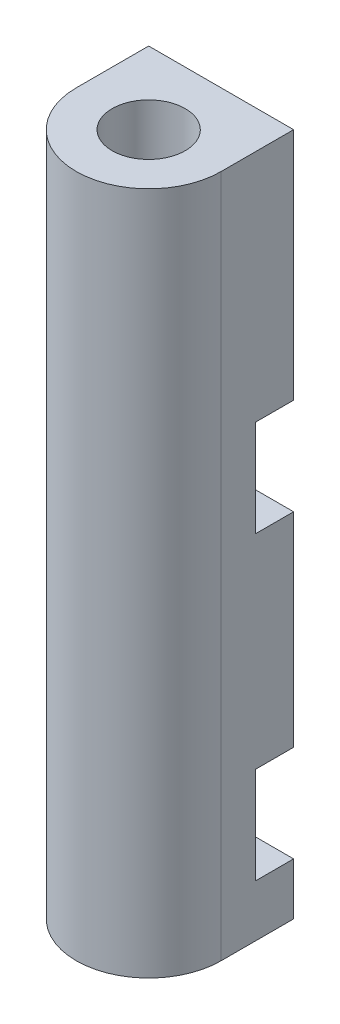
ISO-10303-21;
HEADER;
FILE_DESCRIPTION(('STEP AP214'),'2;1');
FILE_NAME('part.step','',(''),(''),'','','');
FILE_SCHEMA(('AUTOMOTIVE_DESIGN { 1 0 10303 214 1 1 1 1 }'));
ENDSEC;
DATA;
#1=APPLICATION_CONTEXT('core data for automotive mechanical design processes');
#2=APPLICATION_PROTOCOL_DEFINITION('international standard','automotive_design',2000,#1);
#3=PRODUCT_CONTEXT('',#1,'mechanical');
#4=PRODUCT('Part','Part','',(#3));
#5=PRODUCT_RELATED_PRODUCT_CATEGORY('part','',(#4));
#6=PRODUCT_DEFINITION_FORMATION('','',#4);
#7=PRODUCT_DEFINITION_CONTEXT('part definition',#1,'design');
#8=PRODUCT_DEFINITION('design','',#6,#7);
#9=PRODUCT_DEFINITION_SHAPE('','',#8);
#10=(LENGTH_UNIT() NAMED_UNIT(*) SI_UNIT(.MILLI.,.METRE.));
#11=(NAMED_UNIT(*) PLANE_ANGLE_UNIT() SI_UNIT($,.RADIAN.));
#12=(NAMED_UNIT(*) SI_UNIT($,.STERADIAN.) SOLID_ANGLE_UNIT());
#13=UNCERTAINTY_MEASURE_WITH_UNIT(LENGTH_MEASURE(1.E-05),#10,'distance_accuracy_value','');
#14=(GEOMETRIC_REPRESENTATION_CONTEXT(3) GLOBAL_UNCERTAINTY_ASSIGNED_CONTEXT((#13)) GLOBAL_UNIT_ASSIGNED_CONTEXT((#10,
#11,#12)) REPRESENTATION_CONTEXT('',''));
#15=CARTESIAN_POINT('',(0.,0.,0.));
#16=DIRECTION('',(0.,0.,1.));
#17=DIRECTION('',(1.,0.,0.));
#18=AXIS2_PLACEMENT_3D('',#15,#16,#17);
#19=CARTESIAN_POINT('',(0.,56.6,0.));
#20=DIRECTION('',(0.,1.,0.));
#21=DIRECTION('',(0.,0.,1.));
#22=AXIS2_PLACEMENT_3D('',#19,#20,#21);
#23=PLANE('',#22);
#24=DIRECTION('',(0.,0.,-1.));
#25=VECTOR('',#24,1.);
#26=CARTESIAN_POINT('',(-6.,56.6,0.));
#27=LINE('',#26,#25);
#28=CARTESIAN_POINT('',(-6.,56.6,0.));
#29=VERTEX_POINT('',#28);
#30=CARTESIAN_POINT('',(-6.,56.6,-6.));
#31=VERTEX_POINT('',#30);
#32=EDGE_CURVE('E219',#29,#31,#27,.T.);
#33=ORIENTED_EDGE('',*,*,#32,.F.);
#34=CARTESIAN_POINT('',(0.,56.6,0.));
#35=DIRECTION('',(0.,1.,0.));
#36=DIRECTION('',(0.,0.,1.));
#37=AXIS2_PLACEMENT_3D('',#34,#35,#36);
#38=CIRCLE('',#37,6.);
#39=CARTESIAN_POINT('',(6.,56.6,0.));
#40=VERTEX_POINT('',#39);
#41=EDGE_CURVE('E227',#29,#40,#38,.T.);
#42=ORIENTED_EDGE('',*,*,#41,.T.);
#43=DIRECTION('',(0.,0.,1.));
#44=VECTOR('',#43,1.);
#45=CARTESIAN_POINT('',(6.,56.6,-6.));
#46=LINE('',#45,#44);
#47=CARTESIAN_POINT('',(6.,56.6,-6.));
#48=VERTEX_POINT('',#47);
#49=EDGE_CURVE('E225',#48,#40,#46,.T.);
#50=ORIENTED_EDGE('',*,*,#49,.F.);
#51=DIRECTION('',(1.,0.,0.));
#52=VECTOR('',#51,1.);
#53=CARTESIAN_POINT('',(-6.,56.6,-6.));
#54=LINE('',#53,#52);
#55=EDGE_CURVE('E221',#31,#48,#54,.T.);
#56=ORIENTED_EDGE('',*,*,#55,.F.);
#57=EDGE_LOOP('',(#33,#42,#50,#56));
#58=FACE_BOUND('',#57,.T.);
#59=CARTESIAN_POINT('',(0.,56.6,0.));
#60=DIRECTION('',(0.,1.,0.));
#61=DIRECTION('',(0.,0.,1.));
#62=AXIS2_PLACEMENT_3D('',#59,#60,#61);
#63=CIRCLE('',#62,3.025);
#64=CARTESIAN_POINT('',(0.,56.6,3.025));
#65=VERTEX_POINT('',#64);
#66=EDGE_CURVE('E213',#65,#65,#63,.T.);
#67=ORIENTED_EDGE('',*,*,#66,.F.);
#68=EDGE_LOOP('',(#67));
#69=FACE_BOUND('',#68,.T.);
#70=ADVANCED_FACE('F55',(#58,#69),#23,.T.);
#71=CARTESIAN_POINT('',(0.,0.,0.));
#72=DIRECTION('',(0.,1.,0.));
#73=DIRECTION('',(0.,0.,1.));
#74=AXIS2_PLACEMENT_3D('',#71,#72,#73);
#75=PLANE('',#74);
#76=CARTESIAN_POINT('',(0.,0.,0.));
#77=DIRECTION('',(0.,1.,0.));
#78=DIRECTION('',(0.,0.,1.));
#79=AXIS2_PLACEMENT_3D('',#76,#77,#78);
#80=CIRCLE('',#79,6.);
#81=CARTESIAN_POINT('',(-6.,0.,0.));
#82=VERTEX_POINT('',#81);
#83=CARTESIAN_POINT('',(6.,0.,0.));
#84=VERTEX_POINT('',#83);
#85=EDGE_CURVE('E222',#82,#84,#80,.T.);
#86=ORIENTED_EDGE('',*,*,#85,.F.);
#87=DIRECTION('',(0.,0.,-1.));
#88=VECTOR('',#87,1.);
#89=CARTESIAN_POINT('',(-6.,0.,-5.43));
#90=LINE('',#89,#88);
#91=CARTESIAN_POINT('',(-6.,0.,-6.));
#92=VERTEX_POINT('',#91);
#93=EDGE_CURVE('E216',#82,#92,#90,.T.);
#94=ORIENTED_EDGE('',*,*,#93,.T.);
#95=DIRECTION('',(1.,0.,0.));
#96=VECTOR('',#95,1.);
#97=CARTESIAN_POINT('',(-6.,0.,-6.));
#98=LINE('',#97,#96);
#99=CARTESIAN_POINT('',(6.,0.,-6.));
#100=VERTEX_POINT('',#99);
#101=EDGE_CURVE('E233',#92,#100,#98,.T.);
#102=ORIENTED_EDGE('',*,*,#101,.T.);
#103=DIRECTION('',(0.,0.,1.));
#104=VECTOR('',#103,1.);
#105=CARTESIAN_POINT('',(6.,0.,-5.43));
#106=LINE('',#105,#104);
#107=EDGE_CURVE('E236',#100,#84,#106,.T.);
#108=ORIENTED_EDGE('',*,*,#107,.T.);
#109=EDGE_LOOP('',(#86,#94,#102,#108));
#110=FACE_BOUND('',#109,.T.);
#111=CARTESIAN_POINT('',(0.,0.,0.));
#112=DIRECTION('',(0.,1.,0.));
#113=DIRECTION('',(0.,0.,1.));
#114=AXIS2_PLACEMENT_3D('',#111,#112,#113);
#115=CIRCLE('',#114,3.025);
#116=CARTESIAN_POINT('',(0.,0.,3.025));
#117=VERTEX_POINT('',#116);
#118=EDGE_CURVE('E212',#117,#117,#115,.T.);
#119=ORIENTED_EDGE('',*,*,#118,.T.);
#120=EDGE_LOOP('',(#119));
#121=FACE_BOUND('',#120,.T.);
#122=ADVANCED_FACE('F286',(#110,#121),#75,.F.);
#123=CARTESIAN_POINT('',(0.,56.6,0.));
#124=DIRECTION('',(0.,-1.,0.));
#125=DIRECTION('',(0.,0.,-1.));
#126=AXIS2_PLACEMENT_3D('',#123,#124,#125);
#127=CYLINDRICAL_SURFACE('',#126,6.);
#128=ORIENTED_EDGE('',*,*,#85,.T.);
#129=DIRECTION('',(0.,-1.,0.));
#130=VECTOR('',#129,1.);
#131=CARTESIAN_POINT('',(6.,56.6,0.));
#132=LINE('',#131,#130);
#133=EDGE_CURVE('E245',#40,#84,#132,.T.);
#134=ORIENTED_EDGE('',*,*,#133,.F.);
#135=ORIENTED_EDGE('',*,*,#41,.F.);
#136=DIRECTION('',(0.,-1.,0.));
#137=VECTOR('',#136,1.);
#138=CARTESIAN_POINT('',(-6.,56.6,0.));
#139=LINE('',#138,#137);
#140=EDGE_CURVE('E241',#29,#82,#139,.T.);
#141=ORIENTED_EDGE('',*,*,#140,.T.);
#142=EDGE_LOOP('',(#128,#134,#135,#141));
#143=FACE_BOUND('',#142,.T.);
#144=ADVANCED_FACE('F291',(#143),#127,.T.);
#145=CARTESIAN_POINT('',(6.,56.6,-5.43));
#146=DIRECTION('',(1.,0.,0.));
#147=DIRECTION('',(0.,0.,-1.));
#148=AXIS2_PLACEMENT_3D('',#145,#146,#147);
#149=PLANE('',#148);
#150=DIRECTION('',(0.,0.,1.));
#151=VECTOR('',#150,1.);
#152=CARTESIAN_POINT('',(6.,12.3079990340509,-5.43));
#153=LINE('',#152,#151);
#154=CARTESIAN_POINT('',(6.,12.3079990340509,-6.));
#155=VERTEX_POINT('',#154);
#156=CARTESIAN_POINT('',(6.,12.3079990340509,-2.825));
#157=VERTEX_POINT('',#156);
#158=EDGE_CURVE('E210',#155,#157,#153,.T.);
#159=ORIENTED_EDGE('',*,*,#158,.F.);
#160=DIRECTION('',(0.,-1.,0.));
#161=VECTOR('',#160,1.);
#162=CARTESIAN_POINT('',(6.,56.6,-6.));
#163=LINE('',#162,#161);
#164=CARTESIAN_POINT('',(6.,29.1999990340405,-6.));
#165=VERTEX_POINT('',#164);
#166=EDGE_CURVE('E250',#165,#155,#163,.T.);
#167=ORIENTED_EDGE('',*,*,#166,.F.);
#168=DIRECTION('',(0.,0.,-1.));
#169=VECTOR('',#168,1.);
#170=CARTESIAN_POINT('',(6.,29.1999990340405,-5.43));
#171=LINE('',#170,#169);
#172=CARTESIAN_POINT('',(6.,29.1999990340405,-2.825));
#173=VERTEX_POINT('',#172);
#174=EDGE_CURVE('E78',#173,#165,#171,.T.);
#175=ORIENTED_EDGE('',*,*,#174,.F.);
#176=DIRECTION('',(0.,-1.,0.));
#177=VECTOR('',#176,1.);
#178=CARTESIAN_POINT('',(6.,56.6,-2.825));
#179=LINE('',#178,#177);
#180=CARTESIAN_POINT('',(6.,37.1999990340405,-2.825));
#181=VERTEX_POINT('',#180);
#182=EDGE_CURVE('E185',#181,#173,#179,.T.);
#183=ORIENTED_EDGE('',*,*,#182,.F.);
#184=DIRECTION('',(0.,0.,1.));
#185=VECTOR('',#184,1.);
#186=CARTESIAN_POINT('',(6.,37.1999990340405,-5.43));
#187=LINE('',#186,#185);
#188=CARTESIAN_POINT('',(6.,37.1999990340405,-6.));
#189=VERTEX_POINT('',#188);
#190=EDGE_CURVE('E205',#189,#181,#187,.T.);
#191=ORIENTED_EDGE('',*,*,#190,.F.);
#192=EDGE_CURVE('E247',#48,#189,#163,.T.);
#193=ORIENTED_EDGE('',*,*,#192,.F.);
#194=ORIENTED_EDGE('',*,*,#49,.T.);
#195=ORIENTED_EDGE('',*,*,#133,.T.);
#196=ORIENTED_EDGE('',*,*,#107,.F.);
#197=CARTESIAN_POINT('',(6.,4.30799903405329,-6.));
#198=VERTEX_POINT('',#197);
#199=EDGE_CURVE('E251',#198,#100,#163,.T.);
#200=ORIENTED_EDGE('',*,*,#199,.F.);
#201=DIRECTION('',(0.,0.,-1.));
#202=VECTOR('',#201,1.);
#203=CARTESIAN_POINT('',(6.,4.30799903405327,-5.43));
#204=LINE('',#203,#202);
#205=CARTESIAN_POINT('',(6.,4.30799903405327,-2.825));
#206=VERTEX_POINT('',#205);
#207=EDGE_CURVE('E70',#206,#198,#204,.T.);
#208=ORIENTED_EDGE('',*,*,#207,.F.);
#209=DIRECTION('',(0.,-1.,0.));
#210=VECTOR('',#209,1.);
#211=CARTESIAN_POINT('',(6.,56.6,-2.825));
#212=LINE('',#211,#210);
#213=EDGE_CURVE('E207',#157,#206,#212,.T.);
#214=ORIENTED_EDGE('',*,*,#213,.F.);
#215=EDGE_LOOP('',(#159,#167,#175,#183,#191,#193,#194,#195,#196,#200,#208,#214));
#216=FACE_BOUND('',#215,.T.);
#217=ADVANCED_FACE('F278',(#216),#149,.T.);
#218=CARTESIAN_POINT('',(-6.,56.6,-6.));
#219=DIRECTION('',(0.,0.,-1.));
#220=DIRECTION('',(-1.,0.,0.));
#221=AXIS2_PLACEMENT_3D('',#218,#219,#220);
#222=PLANE('',#221);
#223=DIRECTION('',(1.,0.,0.));
#224=VECTOR('',#223,1.);
#225=CARTESIAN_POINT('',(-0.330395971109475,12.3079990340509,-6.));
#226=LINE('',#225,#224);
#227=CARTESIAN_POINT('',(-0.330395971109475,12.3079990340509,-6.));
#228=VERTEX_POINT('',#227);
#229=EDGE_CURVE('E175',#228,#155,#226,.T.);
#230=ORIENTED_EDGE('',*,*,#229,.F.);
#231=DIRECTION('',(0.,1.,0.));
#232=VECTOR('',#231,1.);
#233=CARTESIAN_POINT('',(-0.330395971109478,4.30799903405327,-6.));
#234=LINE('',#233,#232);
#235=CARTESIAN_POINT('',(-0.330395971109478,4.30799903405327,-6.));
#236=VERTEX_POINT('',#235);
#237=EDGE_CURVE('E163',#236,#228,#234,.T.);
#238=ORIENTED_EDGE('',*,*,#237,.F.);
#239=DIRECTION('',(-1.,0.,0.));
#240=VECTOR('',#239,1.);
#241=CARTESIAN_POINT('',(-0.330395971109478,4.30799903405327,-6.));
#242=LINE('',#241,#240);
#243=EDGE_CURVE('E171',#198,#236,#242,.T.);
#244=ORIENTED_EDGE('',*,*,#243,.F.);
#245=ORIENTED_EDGE('',*,*,#199,.T.);
#246=ORIENTED_EDGE('',*,*,#101,.F.);
#247=DIRECTION('',(0.,-1.,0.));
#248=VECTOR('',#247,1.);
#249=CARTESIAN_POINT('',(-6.,56.6,-6.));
#250=LINE('',#249,#248);
#251=EDGE_CURVE('E230',#31,#92,#250,.T.);
#252=ORIENTED_EDGE('',*,*,#251,.F.);
#253=ORIENTED_EDGE('',*,*,#55,.T.);
#254=ORIENTED_EDGE('',*,*,#192,.T.);
#255=DIRECTION('',(1.,0.,0.));
#256=VECTOR('',#255,1.);
#257=CARTESIAN_POINT('',(-0.33039379499359,37.1999990340405,-6.));
#258=LINE('',#257,#256);
#259=CARTESIAN_POINT('',(-0.33039379499359,37.1999990340405,-6.));
#260=VERTEX_POINT('',#259);
#261=EDGE_CURVE('E194',#260,#189,#258,.T.);
#262=ORIENTED_EDGE('',*,*,#261,.F.);
#263=DIRECTION('',(0.,1.,0.));
#264=VECTOR('',#263,1.);
#265=CARTESIAN_POINT('',(-0.33039379499359,29.1999990340405,-6.));
#266=LINE('',#265,#264);
#267=CARTESIAN_POINT('',(-0.33039379499359,29.1999990340405,-6.));
#268=VERTEX_POINT('',#267);
#269=EDGE_CURVE('E191',#268,#260,#266,.T.);
#270=ORIENTED_EDGE('',*,*,#269,.F.);
#271=DIRECTION('',(-1.,0.,0.));
#272=VECTOR('',#271,1.);
#273=CARTESIAN_POINT('',(-0.33039379499359,29.1999990340405,-6.));
#274=LINE('',#273,#272);
#275=EDGE_CURVE('E196',#165,#268,#274,.T.);
#276=ORIENTED_EDGE('',*,*,#275,.F.);
#277=ORIENTED_EDGE('',*,*,#166,.T.);
#278=EDGE_LOOP('',(#230,#238,#244,#245,#246,#252,#253,#254,#262,#270,#276,#277));
#279=FACE_BOUND('',#278,.T.);
#280=ADVANCED_FACE('F177',(#279),#222,.T.);
#281=CARTESIAN_POINT('',(-6.,56.6,-5.43));
#282=DIRECTION('',(-1.,0.,0.));
#283=DIRECTION('',(0.,0.,1.));
#284=AXIS2_PLACEMENT_3D('',#281,#282,#283);
#285=PLANE('',#284);
#286=ORIENTED_EDGE('',*,*,#93,.F.);
#287=ORIENTED_EDGE('',*,*,#140,.F.);
#288=ORIENTED_EDGE('',*,*,#32,.T.);
#289=ORIENTED_EDGE('',*,*,#251,.T.);
#290=EDGE_LOOP('',(#286,#287,#288,#289));
#291=FACE_BOUND('',#290,.T.);
#292=ADVANCED_FACE('F57',(#291),#285,.T.);
#293=CARTESIAN_POINT('',(0.,56.6,0.));
#294=DIRECTION('',(0.,-1.,0.));
#295=DIRECTION('',(0.,0.,-1.));
#296=AXIS2_PLACEMENT_3D('',#293,#294,#295);
#297=CYLINDRICAL_SURFACE('',#296,3.025);
#298=CARTESIAN_POINT('',(0.,12.3079990340509,0.));
#299=DIRECTION('',(0.,1.,0.));
#300=DIRECTION('',(0.,0.,1.));
#301=AXIS2_PLACEMENT_3D('',#298,#299,#300);
#302=CIRCLE('',#301,3.025);
#303=CARTESIAN_POINT('',(1.08166538263919,12.3079990340509,-2.825));
#304=VERTEX_POINT('',#303);
#305=CARTESIAN_POINT('',(-0.330395971109475,12.3079990340509,-3.00690264263322));
#306=VERTEX_POINT('',#305);
#307=EDGE_CURVE('E12',#304,#306,#302,.T.);
#308=ORIENTED_EDGE('',*,*,#307,.F.);
#309=DIRECTION('',(0.,-1.,0.));
#310=VECTOR('',#309,1.);
#311=CARTESIAN_POINT('',(1.08166538263919,56.6,-2.825));
#312=LINE('',#311,#310);
#313=CARTESIAN_POINT('',(1.08166538263919,4.30799903405327,-2.825));
#314=VERTEX_POINT('',#313);
#315=EDGE_CURVE('E261',#314,#304,#312,.F.);
#316=ORIENTED_EDGE('',*,*,#315,.F.);
#317=CARTESIAN_POINT('',(0.,4.30799903405327,0.));
#318=DIRECTION('',(0.,-1.,0.));
#319=DIRECTION('',(0.,0.,-1.));
#320=AXIS2_PLACEMENT_3D('',#317,#318,#319);
#321=CIRCLE('',#320,3.025);
#322=CARTESIAN_POINT('',(-0.330395971109478,4.30799903405327,-3.00690264263322));
#323=VERTEX_POINT('',#322);
#324=EDGE_CURVE('E263',#323,#314,#321,.T.);
#325=ORIENTED_EDGE('',*,*,#324,.F.);
#326=DIRECTION('',(0.,-1.,0.));
#327=VECTOR('',#326,1.);
#328=CARTESIAN_POINT('',(-0.330395971109456,56.6,-3.00690264263322));
#329=LINE('',#328,#327);
#330=EDGE_CURVE('E63',#306,#323,#329,.T.);
#331=ORIENTED_EDGE('',*,*,#330,.F.);
#332=EDGE_LOOP('',(#308,#316,#325,#331));
#333=FACE_BOUND('',#332,.T.);
#334=CARTESIAN_POINT('',(0.,37.1999990340405,0.));
#335=DIRECTION('',(0.,1.,0.));
#336=DIRECTION('',(0.,0.,1.));
#337=AXIS2_PLACEMENT_3D('',#334,#335,#336);
#338=CIRCLE('',#337,3.025);
#339=CARTESIAN_POINT('',(1.08166538263919,37.1999990340405,-2.825));
#340=VERTEX_POINT('',#339);
#341=CARTESIAN_POINT('',(-0.33039379499359,37.1999990340405,-3.00690288174223));
#342=VERTEX_POINT('',#341);
#343=EDGE_CURVE('E259',#340,#342,#338,.T.);
#344=ORIENTED_EDGE('',*,*,#343,.F.);
#345=DIRECTION('',(0.,-1.,0.));
#346=VECTOR('',#345,1.);
#347=CARTESIAN_POINT('',(1.08166538263919,56.6,-2.825));
#348=LINE('',#347,#346);
#349=CARTESIAN_POINT('',(1.08166538263919,29.1999990340405,-2.825));
#350=VERTEX_POINT('',#349);
#351=EDGE_CURVE('E244',#350,#340,#348,.F.);
#352=ORIENTED_EDGE('',*,*,#351,.F.);
#353=CARTESIAN_POINT('',(0.,29.1999990340405,0.));
#354=DIRECTION('',(0.,-1.,0.));
#355=DIRECTION('',(1.,0.,0.));
#356=AXIS2_PLACEMENT_3D('',#353,#354,#355);
#357=CIRCLE('',#356,3.025);
#358=CARTESIAN_POINT('',(-0.33039379499359,29.1999990340405,-3.00690288174223));
#359=VERTEX_POINT('',#358);
#360=EDGE_CURVE('E254',#359,#350,#357,.T.);
#361=ORIENTED_EDGE('',*,*,#360,.F.);
#362=DIRECTION('',(0.,-1.,0.));
#363=VECTOR('',#362,1.);
#364=CARTESIAN_POINT('',(-0.33039379499359,56.6,-3.00690288174223));
#365=LINE('',#364,#363);
#366=EDGE_CURVE('E257',#342,#359,#365,.T.);
#367=ORIENTED_EDGE('',*,*,#366,.F.);
#368=EDGE_LOOP('',(#344,#352,#361,#367));
#369=FACE_BOUND('',#368,.T.);
#370=ORIENTED_EDGE('',*,*,#66,.T.);
#371=EDGE_LOOP('',(#370));
#372=FACE_BOUND('',#371,.T.);
#373=ORIENTED_EDGE('',*,*,#118,.F.);
#374=EDGE_LOOP('',(#373));
#375=FACE_BOUND('',#374,.T.);
#376=ADVANCED_FACE('F267',(#333,#369,#372,#375),#297,.F.);
#377=CARTESIAN_POINT('',(-0.33039379499359,37.1999990340405,-2.825));
#378=DIRECTION('',(0.,1.,0.));
#379=DIRECTION('',(0.,0.,1.));
#380=AXIS2_PLACEMENT_3D('',#377,#378,#379);
#381=PLANE('',#380);
#382=ORIENTED_EDGE('',*,*,#190,.T.);
#383=DIRECTION('',(1.,0.,0.));
#384=VECTOR('',#383,1.);
#385=CARTESIAN_POINT('',(-0.33039379499359,37.1999990340405,-2.825));
#386=LINE('',#385,#384);
#387=EDGE_CURVE('E187',#340,#181,#386,.T.);
#388=ORIENTED_EDGE('',*,*,#387,.F.);
#389=ORIENTED_EDGE('',*,*,#343,.T.);
#390=DIRECTION('',(0.,0.,-1.));
#391=VECTOR('',#390,1.);
#392=CARTESIAN_POINT('',(-0.33039379499359,37.1999990340405,-2.825));
#393=LINE('',#392,#391);
#394=EDGE_CURVE('E200',#342,#260,#393,.T.);
#395=ORIENTED_EDGE('',*,*,#394,.T.);
#396=ORIENTED_EDGE('',*,*,#261,.T.);
#397=EDGE_LOOP('',(#382,#388,#389,#395,#396));
#398=FACE_BOUND('',#397,.T.);
#399=ADVANCED_FACE('F302',(#398),#381,.F.);
#400=CARTESIAN_POINT('',(-0.33039379499359,29.1999990340405,-2.825));
#401=DIRECTION('',(-1.,0.,0.));
#402=DIRECTION('',(0.,0.,1.));
#403=AXIS2_PLACEMENT_3D('',#400,#401,#402);
#404=PLANE('',#403);
#405=ORIENTED_EDGE('',*,*,#366,.T.);
#406=DIRECTION('',(0.,0.,-1.));
#407=VECTOR('',#406,1.);
#408=CARTESIAN_POINT('',(-0.33039379499359,29.1999990340405,-2.825));
#409=LINE('',#408,#407);
#410=EDGE_CURVE('E193',#359,#268,#409,.T.);
#411=ORIENTED_EDGE('',*,*,#410,.T.);
#412=ORIENTED_EDGE('',*,*,#269,.T.);
#413=ORIENTED_EDGE('',*,*,#394,.F.);
#414=EDGE_LOOP('',(#405,#411,#412,#413));
#415=FACE_BOUND('',#414,.T.);
#416=ADVANCED_FACE('F312',(#415),#404,.F.);
#417=CARTESIAN_POINT('',(-0.33039379499359,29.1999990340405,-2.825));
#418=DIRECTION('',(0.,-1.,0.));
#419=DIRECTION('',(1.,0.,0.));
#420=AXIS2_PLACEMENT_3D('',#417,#418,#419);
#421=PLANE('',#420);
#422=ORIENTED_EDGE('',*,*,#174,.T.);
#423=ORIENTED_EDGE('',*,*,#275,.T.);
#424=ORIENTED_EDGE('',*,*,#410,.F.);
#425=ORIENTED_EDGE('',*,*,#360,.T.);
#426=DIRECTION('',(-1.,0.,0.));
#427=VECTOR('',#426,1.);
#428=CARTESIAN_POINT('',(-0.33039379499359,29.1999990340405,-2.825));
#429=LINE('',#428,#427);
#430=EDGE_CURVE('E190',#173,#350,#429,.T.);
#431=ORIENTED_EDGE('',*,*,#430,.F.);
#432=EDGE_LOOP('',(#422,#423,#424,#425,#431));
#433=FACE_BOUND('',#432,.T.);
#434=ADVANCED_FACE('F314',(#433),#421,.F.);
#435=CARTESIAN_POINT('',(0.,0.,-2.825));
#436=DIRECTION('',(0.,0.,1.));
#437=DIRECTION('',(1.,0.,0.));
#438=AXIS2_PLACEMENT_3D('',#435,#436,#437);
#439=PLANE('',#438);
#440=ORIENTED_EDGE('',*,*,#182,.T.);
#441=ORIENTED_EDGE('',*,*,#430,.T.);
#442=ORIENTED_EDGE('',*,*,#351,.T.);
#443=ORIENTED_EDGE('',*,*,#387,.T.);
#444=EDGE_LOOP('',(#440,#441,#442,#443));
#445=FACE_BOUND('',#444,.T.);
#446=ADVANCED_FACE('F305',(#445),#439,.F.);
#447=CARTESIAN_POINT('',(-0.330395971109475,12.3079990340509,-2.825));
#448=DIRECTION('',(0.,1.,0.));
#449=DIRECTION('',(0.,0.,1.));
#450=AXIS2_PLACEMENT_3D('',#447,#448,#449);
#451=PLANE('',#450);
#452=ORIENTED_EDGE('',*,*,#158,.T.);
#453=DIRECTION('',(1.,0.,0.));
#454=VECTOR('',#453,1.);
#455=CARTESIAN_POINT('',(-0.330395971109475,12.3079990340509,-2.825));
#456=LINE('',#455,#454);
#457=EDGE_CURVE('E179',#304,#157,#456,.T.);
#458=ORIENTED_EDGE('',*,*,#457,.F.);
#459=ORIENTED_EDGE('',*,*,#307,.T.);
#460=DIRECTION('',(0.,0.,-1.));
#461=VECTOR('',#460,1.);
#462=CARTESIAN_POINT('',(-0.330395971109475,12.3079990340509,-2.825));
#463=LINE('',#462,#461);
#464=EDGE_CURVE('E168',#306,#228,#463,.T.);
#465=ORIENTED_EDGE('',*,*,#464,.T.);
#466=ORIENTED_EDGE('',*,*,#229,.T.);
#467=EDGE_LOOP('',(#452,#458,#459,#465,#466));
#468=FACE_BOUND('',#467,.T.);
#469=ADVANCED_FACE('F274',(#468),#451,.F.);
#470=CARTESIAN_POINT('',(-0.330395971109478,4.30799903405327,-2.825));
#471=DIRECTION('',(-1.,0.,0.));
#472=DIRECTION('',(0.,-1.,0.));
#473=AXIS2_PLACEMENT_3D('',#470,#471,#472);
#474=PLANE('',#473);
#475=ORIENTED_EDGE('',*,*,#330,.T.);
#476=DIRECTION('',(0.,0.,-1.));
#477=VECTOR('',#476,1.);
#478=CARTESIAN_POINT('',(-0.330395971109478,4.30799903405327,-2.825));
#479=LINE('',#478,#477);
#480=EDGE_CURVE('E159',#323,#236,#479,.T.);
#481=ORIENTED_EDGE('',*,*,#480,.T.);
#482=ORIENTED_EDGE('',*,*,#237,.T.);
#483=ORIENTED_EDGE('',*,*,#464,.F.);
#484=EDGE_LOOP('',(#475,#481,#482,#483));
#485=FACE_BOUND('',#484,.T.);
#486=ADVANCED_FACE('F160',(#485),#474,.F.);
#487=CARTESIAN_POINT('',(-0.330395971109478,4.30799903405327,-2.825));
#488=DIRECTION('',(0.,-1.,0.));
#489=DIRECTION('',(0.,0.,-1.));
#490=AXIS2_PLACEMENT_3D('',#487,#488,#489);
#491=PLANE('',#490);
#492=ORIENTED_EDGE('',*,*,#207,.T.);
#493=ORIENTED_EDGE('',*,*,#243,.T.);
#494=ORIENTED_EDGE('',*,*,#480,.F.);
#495=ORIENTED_EDGE('',*,*,#324,.T.);
#496=DIRECTION('',(-1.,0.,0.));
#497=VECTOR('',#496,1.);
#498=CARTESIAN_POINT('',(-0.330395971109478,4.30799903405327,-2.825));
#499=LINE('',#498,#497);
#500=EDGE_CURVE('E169',#206,#314,#499,.T.);
#501=ORIENTED_EDGE('',*,*,#500,.F.);
#502=EDGE_LOOP('',(#492,#493,#494,#495,#501));
#503=FACE_BOUND('',#502,.T.);
#504=ADVANCED_FACE('F172',(#503),#491,.F.);
#505=CARTESIAN_POINT('',(0.,0.,-2.825));
#506=DIRECTION('',(0.,0.,1.));
#507=DIRECTION('',(1.,0.,0.));
#508=AXIS2_PLACEMENT_3D('',#505,#506,#507);
#509=PLANE('',#508);
#510=ORIENTED_EDGE('',*,*,#213,.T.);
#511=ORIENTED_EDGE('',*,*,#500,.T.);
#512=ORIENTED_EDGE('',*,*,#315,.T.);
#513=ORIENTED_EDGE('',*,*,#457,.T.);
#514=EDGE_LOOP('',(#510,#511,#512,#513));
#515=FACE_BOUND('',#514,.T.);
#516=ADVANCED_FACE('F271',(#515),#509,.F.);
#517=CLOSED_SHELL('',(#70,#122,#144,#217,#280,#292,#376,#399,#416,#434,#446,#469,#486,#504,#516));
#518=MANIFOLD_SOLID_BREP('B2',#517);
#519=ADVANCED_BREP_SHAPE_REPRESENTATION('',(#18,#518),#14);
#520=SHAPE_DEFINITION_REPRESENTATION(#9,#519);
ENDSEC;
END-ISO-10303-21;
